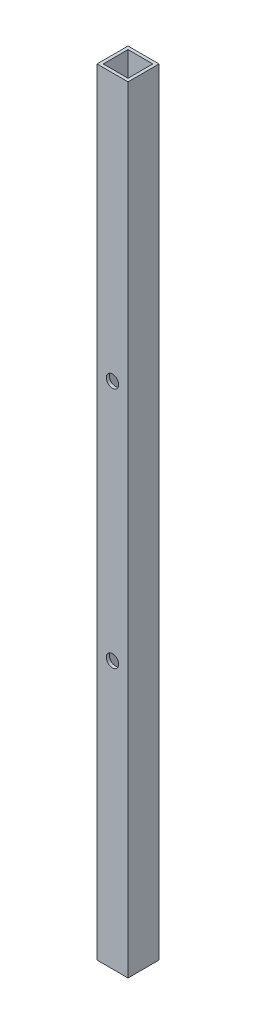
ISO-10303-21;
HEADER;
FILE_DESCRIPTION(('STEP AP214'),'2;1');
FILE_NAME('part.step','',(''),(''),'','','');
FILE_SCHEMA(('AUTOMOTIVE_DESIGN { 1 0 10303 214 1 1 1 1 }'));
ENDSEC;
DATA;
#1=APPLICATION_CONTEXT('core data for automotive mechanical design processes');
#2=APPLICATION_PROTOCOL_DEFINITION('international standard','automotive_design',2000,#1);
#3=PRODUCT_CONTEXT('',#1,'mechanical');
#4=PRODUCT('Part','Part','',(#3));
#5=PRODUCT_RELATED_PRODUCT_CATEGORY('part','',(#4));
#6=PRODUCT_DEFINITION_FORMATION('','',#4);
#7=PRODUCT_DEFINITION_CONTEXT('part definition',#1,'design');
#8=PRODUCT_DEFINITION('design','',#6,#7);
#9=PRODUCT_DEFINITION_SHAPE('','',#8);
#10=(LENGTH_UNIT() NAMED_UNIT(*) SI_UNIT(.MILLI.,.METRE.));
#11=(NAMED_UNIT(*) PLANE_ANGLE_UNIT() SI_UNIT($,.RADIAN.));
#12=(NAMED_UNIT(*) SI_UNIT($,.STERADIAN.) SOLID_ANGLE_UNIT());
#13=UNCERTAINTY_MEASURE_WITH_UNIT(LENGTH_MEASURE(1.E-05),#10,'distance_accuracy_value','');
#14=(GEOMETRIC_REPRESENTATION_CONTEXT(3) GLOBAL_UNCERTAINTY_ASSIGNED_CONTEXT((#13)) GLOBAL_UNIT_ASSIGNED_CONTEXT((#10,
#11,#12)) REPRESENTATION_CONTEXT('',''));
#15=CARTESIAN_POINT('',(0.,0.,0.));
#16=DIRECTION('',(0.,0.,1.));
#17=DIRECTION('',(1.,0.,0.));
#18=AXIS2_PLACEMENT_3D('',#15,#16,#17);
#19=CARTESIAN_POINT('',(0.,250.,0.));
#20=DIRECTION('',(0.,1.,0.));
#21=DIRECTION('',(0.,0.,1.));
#22=AXIS2_PLACEMENT_3D('',#19,#20,#21);
#23=PLANE('',#22);
#24=DIRECTION('',(0.,0.,-1.));
#25=VECTOR('',#24,1.);
#26=CARTESIAN_POINT('',(5.,250.,-5.));
#27=LINE('',#26,#25);
#28=CARTESIAN_POINT('',(5.,250.,5.));
#29=VERTEX_POINT('',#28);
#30=CARTESIAN_POINT('',(5.,250.,-5.));
#31=VERTEX_POINT('',#30);
#32=EDGE_CURVE('E140',#29,#31,#27,.T.);
#33=ORIENTED_EDGE('',*,*,#32,.T.);
#34=DIRECTION('',(-1.,0.,0.));
#35=VECTOR('',#34,1.);
#36=CARTESIAN_POINT('',(-5.00000000000001,250.,-5.));
#37=LINE('',#36,#35);
#38=CARTESIAN_POINT('',(-5.00000000000001,250.,-5.));
#39=VERTEX_POINT('',#38);
#40=EDGE_CURVE('E143',#31,#39,#37,.T.);
#41=ORIENTED_EDGE('',*,*,#40,.T.);
#42=DIRECTION('',(0.,0.,1.));
#43=VECTOR('',#42,1.);
#44=CARTESIAN_POINT('',(-5.00000000000001,250.,-5.));
#45=LINE('',#44,#43);
#46=CARTESIAN_POINT('',(-5.00000000000001,250.,5.));
#47=VERTEX_POINT('',#46);
#48=EDGE_CURVE('E146',#39,#47,#45,.T.);
#49=ORIENTED_EDGE('',*,*,#48,.T.);
#50=DIRECTION('',(1.,0.,0.));
#51=VECTOR('',#50,1.);
#52=CARTESIAN_POINT('',(-5.00000000000001,250.,5.));
#53=LINE('',#52,#51);
#54=EDGE_CURVE('E148',#47,#29,#53,.T.);
#55=ORIENTED_EDGE('',*,*,#54,.T.);
#56=EDGE_LOOP('',(#33,#41,#49,#55));
#57=FACE_BOUND('',#56,.T.);
#58=DIRECTION('',(-1.,0.,0.));
#59=VECTOR('',#58,1.);
#60=CARTESIAN_POINT('',(-4.,250.,-4.));
#61=LINE('',#60,#59);
#62=CARTESIAN_POINT('',(4.,250.,-4.));
#63=VERTEX_POINT('',#62);
#64=CARTESIAN_POINT('',(-4.,250.,-4.));
#65=VERTEX_POINT('',#64);
#66=EDGE_CURVE('E110',#63,#65,#61,.T.);
#67=ORIENTED_EDGE('',*,*,#66,.F.);
#68=DIRECTION('',(0.,0.,-1.));
#69=VECTOR('',#68,1.);
#70=CARTESIAN_POINT('',(4.,250.,-4.));
#71=LINE('',#70,#69);
#72=CARTESIAN_POINT('',(4.,250.,4.));
#73=VERTEX_POINT('',#72);
#74=EDGE_CURVE('E102',#73,#63,#71,.T.);
#75=ORIENTED_EDGE('',*,*,#74,.F.);
#76=DIRECTION('',(1.,0.,0.));
#77=VECTOR('',#76,1.);
#78=CARTESIAN_POINT('',(-4.,250.,4.));
#79=LINE('',#78,#77);
#80=CARTESIAN_POINT('',(-4.,250.,4.));
#81=VERTEX_POINT('',#80);
#82=EDGE_CURVE('E124',#81,#73,#79,.T.);
#83=ORIENTED_EDGE('',*,*,#82,.F.);
#84=DIRECTION('',(0.,0.,1.));
#85=VECTOR('',#84,1.);
#86=CARTESIAN_POINT('',(-4.,250.,-4.));
#87=LINE('',#86,#85);
#88=EDGE_CURVE('E122',#65,#81,#87,.T.);
#89=ORIENTED_EDGE('',*,*,#88,.F.);
#90=EDGE_LOOP('',(#67,#75,#83,#89));
#91=FACE_BOUND('',#90,.T.);
#92=ADVANCED_FACE('F35',(#57,#91),#23,.T.);
#93=CARTESIAN_POINT('',(0.,0.,0.));
#94=DIRECTION('',(0.,1.,0.));
#95=DIRECTION('',(0.,0.,1.));
#96=AXIS2_PLACEMENT_3D('',#93,#94,#95);
#97=PLANE('',#96);
#98=DIRECTION('',(0.,0.,-1.));
#99=VECTOR('',#98,1.);
#100=CARTESIAN_POINT('',(5.,0.,-5.));
#101=LINE('',#100,#99);
#102=CARTESIAN_POINT('',(5.,0.,5.));
#103=VERTEX_POINT('',#102);
#104=CARTESIAN_POINT('',(5.,0.,-5.));
#105=VERTEX_POINT('',#104);
#106=EDGE_CURVE('E118',#103,#105,#101,.T.);
#107=ORIENTED_EDGE('',*,*,#106,.F.);
#108=DIRECTION('',(1.,0.,0.));
#109=VECTOR('',#108,1.);
#110=CARTESIAN_POINT('',(-5.00000000000001,0.,5.));
#111=LINE('',#110,#109);
#112=CARTESIAN_POINT('',(-5.00000000000001,0.,5.));
#113=VERTEX_POINT('',#112);
#114=EDGE_CURVE('E144',#113,#103,#111,.T.);
#115=ORIENTED_EDGE('',*,*,#114,.F.);
#116=DIRECTION('',(0.,0.,1.));
#117=VECTOR('',#116,1.);
#118=CARTESIAN_POINT('',(-5.00000000000001,0.,-5.));
#119=LINE('',#118,#117);
#120=CARTESIAN_POINT('',(-5.00000000000001,0.,-5.));
#121=VERTEX_POINT('',#120);
#122=EDGE_CURVE('E155',#121,#113,#119,.T.);
#123=ORIENTED_EDGE('',*,*,#122,.F.);
#124=DIRECTION('',(-1.,0.,0.));
#125=VECTOR('',#124,1.);
#126=CARTESIAN_POINT('',(-5.00000000000001,0.,-5.));
#127=LINE('',#126,#125);
#128=EDGE_CURVE('E153',#105,#121,#127,.T.);
#129=ORIENTED_EDGE('',*,*,#128,.F.);
#130=EDGE_LOOP('',(#107,#115,#123,#129));
#131=FACE_BOUND('',#130,.T.);
#132=DIRECTION('',(0.,0.,-1.));
#133=VECTOR('',#132,1.);
#134=CARTESIAN_POINT('',(4.,0.,-4.));
#135=LINE('',#134,#133);
#136=CARTESIAN_POINT('',(4.,0.,4.));
#137=VERTEX_POINT('',#136);
#138=CARTESIAN_POINT('',(4.,0.,-4.));
#139=VERTEX_POINT('',#138);
#140=EDGE_CURVE('E60',#137,#139,#135,.T.);
#141=ORIENTED_EDGE('',*,*,#140,.T.);
#142=DIRECTION('',(-1.,0.,0.));
#143=VECTOR('',#142,1.);
#144=CARTESIAN_POINT('',(-4.,0.,-4.));
#145=LINE('',#144,#143);
#146=CARTESIAN_POINT('',(-4.,0.,-4.));
#147=VERTEX_POINT('',#146);
#148=EDGE_CURVE('E117',#139,#147,#145,.T.);
#149=ORIENTED_EDGE('',*,*,#148,.T.);
#150=DIRECTION('',(0.,0.,1.));
#151=VECTOR('',#150,1.);
#152=CARTESIAN_POINT('',(-4.,0.,-4.));
#153=LINE('',#152,#151);
#154=CARTESIAN_POINT('',(-4.,0.,4.));
#155=VERTEX_POINT('',#154);
#156=EDGE_CURVE('E132',#147,#155,#153,.T.);
#157=ORIENTED_EDGE('',*,*,#156,.T.);
#158=DIRECTION('',(1.,0.,0.));
#159=VECTOR('',#158,1.);
#160=CARTESIAN_POINT('',(-4.,0.,4.));
#161=LINE('',#160,#159);
#162=EDGE_CURVE('E111',#155,#137,#161,.T.);
#163=ORIENTED_EDGE('',*,*,#162,.T.);
#164=EDGE_LOOP('',(#141,#149,#157,#163));
#165=FACE_BOUND('',#164,.T.);
#166=ADVANCED_FACE('F205',(#131,#165),#97,.F.);
#167=CARTESIAN_POINT('',(5.,250.,-5.));
#168=DIRECTION('',(-1.,0.,0.));
#169=DIRECTION('',(0.,0.,1.));
#170=AXIS2_PLACEMENT_3D('',#167,#168,#169);
#171=PLANE('',#170);
#172=ORIENTED_EDGE('',*,*,#106,.T.);
#173=DIRECTION('',(0.,-1.,0.));
#174=VECTOR('',#173,1.);
#175=CARTESIAN_POINT('',(5.,250.,-5.));
#176=LINE('',#175,#174);
#177=EDGE_CURVE('E11',#31,#105,#176,.T.);
#178=ORIENTED_EDGE('',*,*,#177,.F.);
#179=ORIENTED_EDGE('',*,*,#32,.F.);
#180=DIRECTION('',(0.,-1.,0.));
#181=VECTOR('',#180,1.);
#182=CARTESIAN_POINT('',(5.,250.,5.));
#183=LINE('',#182,#181);
#184=EDGE_CURVE('E150',#29,#103,#183,.T.);
#185=ORIENTED_EDGE('',*,*,#184,.T.);
#186=EDGE_LOOP('',(#172,#178,#179,#185));
#187=FACE_BOUND('',#186,.T.);
#188=ADVANCED_FACE('F37',(#187),#171,.F.);
#189=CARTESIAN_POINT('',(-5.00000000000001,250.,-5.));
#190=DIRECTION('',(0.,0.,1.));
#191=DIRECTION('',(1.,0.,0.));
#192=AXIS2_PLACEMENT_3D('',#189,#190,#191);
#193=PLANE('',#192);
#194=CARTESIAN_POINT('',(0.,86.,-5.));
#195=DIRECTION('',(0.,0.,-1.));
#196=DIRECTION('',(-1.,0.,0.));
#197=AXIS2_PLACEMENT_3D('',#194,#195,#196);
#198=CIRCLE('',#197,2.);
#199=CARTESIAN_POINT('',(-2.,86.,-5.));
#200=VERTEX_POINT('',#199);
#201=EDGE_CURVE('E184',#200,#200,#198,.T.);
#202=ORIENTED_EDGE('',*,*,#201,.F.);
#203=EDGE_LOOP('',(#202));
#204=FACE_BOUND('',#203,.T.);
#205=CARTESIAN_POINT('',(0.,164.,-5.));
#206=DIRECTION('',(0.,0.,-1.));
#207=DIRECTION('',(-1.,0.,0.));
#208=AXIS2_PLACEMENT_3D('',#205,#206,#207);
#209=CIRCLE('',#208,2.);
#210=CARTESIAN_POINT('',(-2.,164.,-5.));
#211=VERTEX_POINT('',#210);
#212=EDGE_CURVE('E171',#211,#211,#209,.T.);
#213=ORIENTED_EDGE('',*,*,#212,.F.);
#214=EDGE_LOOP('',(#213));
#215=FACE_BOUND('',#214,.T.);
#216=ORIENTED_EDGE('',*,*,#128,.T.);
#217=DIRECTION('',(0.,-1.,0.));
#218=VECTOR('',#217,1.);
#219=CARTESIAN_POINT('',(-5.00000000000001,250.,-5.));
#220=LINE('',#219,#218);
#221=EDGE_CURVE('E44',#39,#121,#220,.T.);
#222=ORIENTED_EDGE('',*,*,#221,.F.);
#223=ORIENTED_EDGE('',*,*,#40,.F.);
#224=ORIENTED_EDGE('',*,*,#177,.T.);
#225=EDGE_LOOP('',(#216,#222,#223,#224));
#226=FACE_BOUND('',#225,.T.);
#227=ADVANCED_FACE('F190',(#204,#215,#226),#193,.F.);
#228=CARTESIAN_POINT('',(-5.00000000000001,250.,-5.));
#229=DIRECTION('',(1.,0.,0.));
#230=DIRECTION('',(0.,0.,-1.));
#231=AXIS2_PLACEMENT_3D('',#228,#229,#230);
#232=PLANE('',#231);
#233=ORIENTED_EDGE('',*,*,#122,.T.);
#234=DIRECTION('',(0.,-1.,0.));
#235=VECTOR('',#234,1.);
#236=CARTESIAN_POINT('',(-5.00000000000001,250.,5.));
#237=LINE('',#236,#235);
#238=EDGE_CURVE('E160',#47,#113,#237,.T.);
#239=ORIENTED_EDGE('',*,*,#238,.F.);
#240=ORIENTED_EDGE('',*,*,#48,.F.);
#241=ORIENTED_EDGE('',*,*,#221,.T.);
#242=EDGE_LOOP('',(#233,#239,#240,#241));
#243=FACE_BOUND('',#242,.T.);
#244=ADVANCED_FACE('F193',(#243),#232,.F.);
#245=CARTESIAN_POINT('',(-5.00000000000001,250.,5.));
#246=DIRECTION('',(0.,0.,-1.));
#247=DIRECTION('',(-1.,0.,0.));
#248=AXIS2_PLACEMENT_3D('',#245,#246,#247);
#249=PLANE('',#248);
#250=CARTESIAN_POINT('',(0.,86.,5.));
#251=DIRECTION('',(0.,0.,-1.));
#252=DIRECTION('',(-1.,0.,0.));
#253=AXIS2_PLACEMENT_3D('',#250,#251,#252);
#254=CIRCLE('',#253,2.);
#255=CARTESIAN_POINT('',(-2.,86.,5.));
#256=VERTEX_POINT('',#255);
#257=EDGE_CURVE('E181',#256,#256,#254,.T.);
#258=ORIENTED_EDGE('',*,*,#257,.T.);
#259=EDGE_LOOP('',(#258));
#260=FACE_BOUND('',#259,.T.);
#261=CARTESIAN_POINT('',(0.,164.,5.));
#262=DIRECTION('',(0.,0.,-1.));
#263=DIRECTION('',(-1.,0.,0.));
#264=AXIS2_PLACEMENT_3D('',#261,#262,#263);
#265=CIRCLE('',#264,2.);
#266=CARTESIAN_POINT('',(-2.,164.,5.));
#267=VERTEX_POINT('',#266);
#268=EDGE_CURVE('E166',#267,#267,#265,.T.);
#269=ORIENTED_EDGE('',*,*,#268,.T.);
#270=EDGE_LOOP('',(#269));
#271=FACE_BOUND('',#270,.T.);
#272=ORIENTED_EDGE('',*,*,#114,.T.);
#273=ORIENTED_EDGE('',*,*,#184,.F.);
#274=ORIENTED_EDGE('',*,*,#54,.F.);
#275=ORIENTED_EDGE('',*,*,#238,.T.);
#276=EDGE_LOOP('',(#272,#273,#274,#275));
#277=FACE_BOUND('',#276,.T.);
#278=ADVANCED_FACE('F209',(#260,#271,#277),#249,.F.);
#279=CARTESIAN_POINT('',(4.,250.,-4.));
#280=DIRECTION('',(-1.,0.,0.));
#281=DIRECTION('',(0.,0.,1.));
#282=AXIS2_PLACEMENT_3D('',#279,#280,#281);
#283=PLANE('',#282);
#284=ORIENTED_EDGE('',*,*,#140,.F.);
#285=DIRECTION('',(0.,-1.,0.));
#286=VECTOR('',#285,1.);
#287=CARTESIAN_POINT('',(4.,250.,4.));
#288=LINE('',#287,#286);
#289=EDGE_CURVE('E106',#73,#137,#288,.T.);
#290=ORIENTED_EDGE('',*,*,#289,.F.);
#291=ORIENTED_EDGE('',*,*,#74,.T.);
#292=DIRECTION('',(0.,-1.,0.));
#293=VECTOR('',#292,1.);
#294=CARTESIAN_POINT('',(4.,250.,-4.));
#295=LINE('',#294,#293);
#296=EDGE_CURVE('E105',#63,#139,#295,.T.);
#297=ORIENTED_EDGE('',*,*,#296,.T.);
#298=EDGE_LOOP('',(#284,#290,#291,#297));
#299=FACE_BOUND('',#298,.T.);
#300=ADVANCED_FACE('F104',(#299),#283,.T.);
#301=CARTESIAN_POINT('',(-4.,250.,-4.));
#302=DIRECTION('',(0.,0.,1.));
#303=DIRECTION('',(1.,0.,0.));
#304=AXIS2_PLACEMENT_3D('',#301,#302,#303);
#305=PLANE('',#304);
#306=CARTESIAN_POINT('',(0.,86.,-4.));
#307=DIRECTION('',(0.,0.,1.));
#308=DIRECTION('',(1.,0.,0.));
#309=AXIS2_PLACEMENT_3D('',#306,#307,#308);
#310=CIRCLE('',#309,2.);
#311=CARTESIAN_POINT('',(2.,86.,-4.));
#312=VERTEX_POINT('',#311);
#313=EDGE_CURVE('E176',#312,#312,#310,.T.);
#314=ORIENTED_EDGE('',*,*,#313,.F.);
#315=EDGE_LOOP('',(#314));
#316=FACE_BOUND('',#315,.T.);
#317=CARTESIAN_POINT('',(0.,164.,-4.));
#318=DIRECTION('',(0.,0.,1.));
#319=DIRECTION('',(1.,0.,0.));
#320=AXIS2_PLACEMENT_3D('',#317,#318,#319);
#321=CIRCLE('',#320,2.);
#322=CARTESIAN_POINT('',(2.,164.,-4.));
#323=VERTEX_POINT('',#322);
#324=EDGE_CURVE('E130',#323,#323,#321,.T.);
#325=ORIENTED_EDGE('',*,*,#324,.F.);
#326=EDGE_LOOP('',(#325));
#327=FACE_BOUND('',#326,.T.);
#328=ORIENTED_EDGE('',*,*,#148,.F.);
#329=ORIENTED_EDGE('',*,*,#296,.F.);
#330=ORIENTED_EDGE('',*,*,#66,.T.);
#331=DIRECTION('',(0.,-1.,0.));
#332=VECTOR('',#331,1.);
#333=CARTESIAN_POINT('',(-4.,250.,-4.));
#334=LINE('',#333,#332);
#335=EDGE_CURVE('E119',#65,#147,#334,.T.);
#336=ORIENTED_EDGE('',*,*,#335,.T.);
#337=EDGE_LOOP('',(#328,#329,#330,#336));
#338=FACE_BOUND('',#337,.T.);
#339=ADVANCED_FACE('F114',(#316,#327,#338),#305,.T.);
#340=CARTESIAN_POINT('',(-4.,250.,-4.));
#341=DIRECTION('',(1.,0.,0.));
#342=DIRECTION('',(0.,0.,-1.));
#343=AXIS2_PLACEMENT_3D('',#340,#341,#342);
#344=PLANE('',#343);
#345=ORIENTED_EDGE('',*,*,#156,.F.);
#346=ORIENTED_EDGE('',*,*,#335,.F.);
#347=ORIENTED_EDGE('',*,*,#88,.T.);
#348=DIRECTION('',(0.,-1.,0.));
#349=VECTOR('',#348,1.);
#350=CARTESIAN_POINT('',(-4.,250.,4.));
#351=LINE('',#350,#349);
#352=EDGE_CURVE('E52',#81,#155,#351,.T.);
#353=ORIENTED_EDGE('',*,*,#352,.T.);
#354=EDGE_LOOP('',(#345,#346,#347,#353));
#355=FACE_BOUND('',#354,.T.);
#356=ADVANCED_FACE('F253',(#355),#344,.T.);
#357=CARTESIAN_POINT('',(-4.,250.,4.));
#358=DIRECTION('',(0.,0.,-1.));
#359=DIRECTION('',(-1.,0.,0.));
#360=AXIS2_PLACEMENT_3D('',#357,#358,#359);
#361=PLANE('',#360);
#362=CARTESIAN_POINT('',(0.,86.,4.));
#363=DIRECTION('',(0.,0.,-1.));
#364=DIRECTION('',(-1.,0.,0.));
#365=AXIS2_PLACEMENT_3D('',#362,#363,#364);
#366=CIRCLE('',#365,2.);
#367=CARTESIAN_POINT('',(-2.,86.,4.));
#368=VERTEX_POINT('',#367);
#369=EDGE_CURVE('E39',#368,#368,#366,.T.);
#370=ORIENTED_EDGE('',*,*,#369,.F.);
#371=EDGE_LOOP('',(#370));
#372=FACE_BOUND('',#371,.T.);
#373=CARTESIAN_POINT('',(0.,164.,4.));
#374=DIRECTION('',(0.,0.,-1.));
#375=DIRECTION('',(-1.,0.,0.));
#376=AXIS2_PLACEMENT_3D('',#373,#374,#375);
#377=CIRCLE('',#376,2.);
#378=CARTESIAN_POINT('',(-2.,164.,4.));
#379=VERTEX_POINT('',#378);
#380=EDGE_CURVE('E164',#379,#379,#377,.T.);
#381=ORIENTED_EDGE('',*,*,#380,.F.);
#382=EDGE_LOOP('',(#381));
#383=FACE_BOUND('',#382,.T.);
#384=ORIENTED_EDGE('',*,*,#162,.F.);
#385=ORIENTED_EDGE('',*,*,#352,.F.);
#386=ORIENTED_EDGE('',*,*,#82,.T.);
#387=ORIENTED_EDGE('',*,*,#289,.T.);
#388=EDGE_LOOP('',(#384,#385,#386,#387));
#389=FACE_BOUND('',#388,.T.);
#390=ADVANCED_FACE('F262',(#372,#383,#389),#361,.T.);
#391=CARTESIAN_POINT('',(0.,164.,-5.));
#392=DIRECTION('',(0.,0.,-1.));
#393=DIRECTION('',(-1.,0.,0.));
#394=AXIS2_PLACEMENT_3D('',#391,#392,#393);
#395=CYLINDRICAL_SURFACE('',#394,2.);
#396=ORIENTED_EDGE('',*,*,#380,.T.);
#397=EDGE_LOOP('',(#396));
#398=FACE_BOUND('',#397,.T.);
#399=ORIENTED_EDGE('',*,*,#268,.F.);
#400=EDGE_LOOP('',(#399));
#401=FACE_BOUND('',#400,.T.);
#402=ADVANCED_FACE('F270',(#398,#401),#395,.F.);
#403=ORIENTED_EDGE('',*,*,#324,.T.);
#404=EDGE_LOOP('',(#403));
#405=FACE_BOUND('',#404,.T.);
#406=ORIENTED_EDGE('',*,*,#212,.T.);
#407=EDGE_LOOP('',(#406));
#408=FACE_BOUND('',#407,.T.);
#409=ADVANCED_FACE('F280',(#405,#408),#395,.F.);
#410=CARTESIAN_POINT('',(0.,86.,-5.));
#411=DIRECTION('',(0.,0.,-1.));
#412=DIRECTION('',(-1.,0.,0.));
#413=AXIS2_PLACEMENT_3D('',#410,#411,#412);
#414=CYLINDRICAL_SURFACE('',#413,2.);
#415=ORIENTED_EDGE('',*,*,#369,.T.);
#416=EDGE_LOOP('',(#415));
#417=FACE_BOUND('',#416,.T.);
#418=ORIENTED_EDGE('',*,*,#257,.F.);
#419=EDGE_LOOP('',(#418));
#420=FACE_BOUND('',#419,.T.);
#421=ADVANCED_FACE('F286',(#417,#420),#414,.F.);
#422=ORIENTED_EDGE('',*,*,#313,.T.);
#423=EDGE_LOOP('',(#422));
#424=FACE_BOUND('',#423,.T.);
#425=ORIENTED_EDGE('',*,*,#201,.T.);
#426=EDGE_LOOP('',(#425));
#427=FACE_BOUND('',#426,.T.);
#428=ADVANCED_FACE('F188',(#424,#427),#414,.F.);
#429=CLOSED_SHELL('',(#92,#166,#188,#227,#244,#278,#300,#339,#356,#390,#402,#409,#421,#428));
#430=MANIFOLD_SOLID_BREP('B2',#429);
#431=ADVANCED_BREP_SHAPE_REPRESENTATION('',(#18,#430),#14);
#432=SHAPE_DEFINITION_REPRESENTATION(#9,#431);
ENDSEC;
END-ISO-10303-21;
